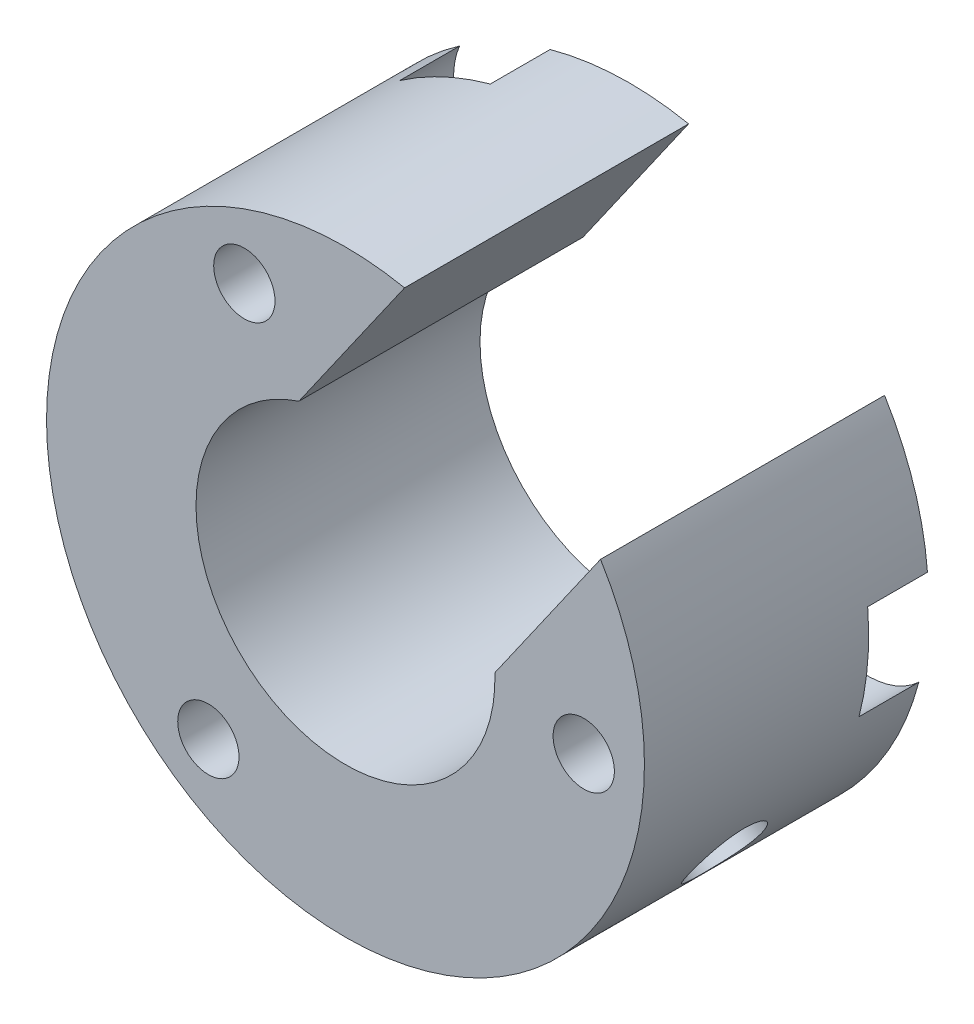
ISO-10303-21;
HEADER;
FILE_DESCRIPTION(('STEP AP214'),'2;1');
FILE_NAME('part.step','',(''),(''),'','','');
FILE_SCHEMA(('AUTOMOTIVE_DESIGN { 1 0 10303 214 1 1 1 1 }'));
ENDSEC;
DATA;
#1=APPLICATION_CONTEXT('core data for automotive mechanical design processes');
#2=APPLICATION_PROTOCOL_DEFINITION('international standard','automotive_design',2000,#1);
#3=PRODUCT_CONTEXT('',#1,'mechanical');
#4=PRODUCT('Part','Part','',(#3));
#5=PRODUCT_RELATED_PRODUCT_CATEGORY('part','',(#4));
#6=PRODUCT_DEFINITION_FORMATION('','',#4);
#7=PRODUCT_DEFINITION_CONTEXT('part definition',#1,'design');
#8=PRODUCT_DEFINITION('design','',#6,#7);
#9=PRODUCT_DEFINITION_SHAPE('','',#8);
#10=(LENGTH_UNIT() NAMED_UNIT(*) SI_UNIT(.MILLI.,.METRE.));
#11=(NAMED_UNIT(*) PLANE_ANGLE_UNIT() SI_UNIT($,.RADIAN.));
#12=(NAMED_UNIT(*) SI_UNIT($,.STERADIAN.) SOLID_ANGLE_UNIT());
#13=UNCERTAINTY_MEASURE_WITH_UNIT(LENGTH_MEASURE(1.E-05),#10,'distance_accuracy_value','');
#14=(GEOMETRIC_REPRESENTATION_CONTEXT(3) GLOBAL_UNCERTAINTY_ASSIGNED_CONTEXT((#13)) GLOBAL_UNIT_ASSIGNED_CONTEXT((#10,
#11,#12)) REPRESENTATION_CONTEXT('',''));
#15=CARTESIAN_POINT('',(0.,0.,0.));
#16=DIRECTION('',(0.,0.,1.));
#17=DIRECTION('',(1.,0.,0.));
#18=AXIS2_PLACEMENT_3D('',#15,#16,#17);
#19=CARTESIAN_POINT('',(-11.857295948113,5.24523020213218,9.5));
#20=DIRECTION('',(0.,0.,-1.));
#21=DIRECTION('',(-1.,0.,0.));
#22=AXIS2_PLACEMENT_3D('',#19,#20,#21);
#23=CYLINDRICAL_SURFACE('',#22,1.025);
#24=CARTESIAN_POINT('',(-11.857295948113,5.24523020213218,9.5));
#25=DIRECTION('',(0.,0.,1.));
#26=DIRECTION('',(1.,0.,0.));
#27=AXIS2_PLACEMENT_3D('',#24,#25,#26);
#28=CIRCLE('',#27,1.025);
#29=CARTESIAN_POINT('',(-10.832295948113,5.24523020213218,9.5));
#30=VERTEX_POINT('',#29);
#31=EDGE_CURVE('E216',#30,#30,#28,.T.);
#32=ORIENTED_EDGE('',*,*,#31,.T.);
#33=EDGE_LOOP('',(#32));
#34=FACE_BOUND('',#33,.T.);
#35=CARTESIAN_POINT('',(-11.857295948113,5.24523020213218,2.));
#36=DIRECTION('',(0.,0.,-1.));
#37=DIRECTION('',(-1.,0.,0.));
#38=AXIS2_PLACEMENT_3D('',#35,#36,#37);
#39=CIRCLE('',#38,1.025);
#40=CARTESIAN_POINT('',(-12.882295948113,5.24523020213218,2.));
#41=VERTEX_POINT('',#40);
#42=EDGE_CURVE('E42',#41,#41,#39,.T.);
#43=ORIENTED_EDGE('',*,*,#42,.T.);
#44=EDGE_LOOP('',(#43));
#45=FACE_BOUND('',#44,.T.);
#46=ADVANCED_FACE('F38',(#34,#45),#23,.F.);
#47=CARTESIAN_POINT('',(-13.0604293965396,-8.55884419296135,9.5));
#48=DIRECTION('',(0.,0.,-1.));
#49=DIRECTION('',(-1.,0.,0.));
#50=AXIS2_PLACEMENT_3D('',#47,#48,#49);
#51=CYLINDRICAL_SURFACE('',#50,1.025);
#52=CARTESIAN_POINT('',(-13.0604293965396,-8.55884419296135,9.5));
#53=DIRECTION('',(0.,0.,1.));
#54=DIRECTION('',(1.,0.,0.));
#55=AXIS2_PLACEMENT_3D('',#52,#53,#54);
#56=CIRCLE('',#55,1.025);
#57=CARTESIAN_POINT('',(-12.0354293965396,-8.55884419296135,9.5));
#58=VERTEX_POINT('',#57);
#59=EDGE_CURVE('E305',#58,#58,#56,.T.);
#60=ORIENTED_EDGE('',*,*,#59,.T.);
#61=EDGE_LOOP('',(#60));
#62=FACE_BOUND('',#61,.T.);
#63=CARTESIAN_POINT('',(-13.0604293965396,-8.55884419296135,2.));
#64=DIRECTION('',(0.,0.,-1.));
#65=DIRECTION('',(-1.,0.,0.));
#66=AXIS2_PLACEMENT_3D('',#63,#64,#65);
#67=CIRCLE('',#66,1.025);
#68=CARTESIAN_POINT('',(-14.0854293965396,-8.55884419296135,2.));
#69=VERTEX_POINT('',#68);
#70=EDGE_CURVE('E247',#69,#69,#67,.T.);
#71=ORIENTED_EDGE('',*,*,#70,.T.);
#72=EDGE_LOOP('',(#71));
#73=FACE_BOUND('',#72,.T.);
#74=ADVANCED_FACE('F207',(#62,#73),#51,.F.);
#75=CARTESIAN_POINT('',(-0.504183570444983,-2.69875112589484,9.5));
#76=DIRECTION('',(0.,0.,-1.));
#77=DIRECTION('',(-1.,0.,0.));
#78=AXIS2_PLACEMENT_3D('',#75,#76,#77);
#79=CYLINDRICAL_SURFACE('',#78,1.025);
#80=CARTESIAN_POINT('',(-0.504183570444983,-2.69875112589484,9.5));
#81=DIRECTION('',(0.,0.,1.));
#82=DIRECTION('',(1.,0.,0.));
#83=AXIS2_PLACEMENT_3D('',#80,#81,#82);
#84=CIRCLE('',#83,1.025);
#85=CARTESIAN_POINT('',(0.520816429555017,-2.69875112589484,9.5));
#86=VERTEX_POINT('',#85);
#87=EDGE_CURVE('E284',#86,#86,#84,.T.);
#88=ORIENTED_EDGE('',*,*,#87,.T.);
#89=EDGE_LOOP('',(#88));
#90=FACE_BOUND('',#89,.T.);
#91=CARTESIAN_POINT('',(-0.504183570444983,-2.69875112589484,2.));
#92=DIRECTION('',(0.,0.,-1.));
#93=DIRECTION('',(-1.,0.,0.));
#94=AXIS2_PLACEMENT_3D('',#91,#92,#93);
#95=CIRCLE('',#94,1.025);
#96=CARTESIAN_POINT('',(-1.52918357044498,-2.69875112589484,2.));
#97=VERTEX_POINT('',#96);
#98=EDGE_CURVE('E242',#97,#97,#95,.T.);
#99=ORIENTED_EDGE('',*,*,#98,.T.);
#100=EDGE_LOOP('',(#99));
#101=FACE_BOUND('',#100,.T.);
#102=ADVANCED_FACE('F40',(#90,#101),#79,.F.);
#103=CARTESIAN_POINT('',(-8.47396963836586,-2.00412170557468,9.5));
#104=DIRECTION('',(0.,0.,-1.));
#105=DIRECTION('',(-1.,0.,0.));
#106=AXIS2_PLACEMENT_3D('',#103,#104,#105);
#107=CYLINDRICAL_SURFACE('',#106,5.);
#108=CARTESIAN_POINT('',(-11.7239495250043,1.79556653643225,5.));
#109=CARTESIAN_POINT('',(-11.7239517287085,1.79556568537682,5.0690253754623));
#110=CARTESIAN_POINT('',(-11.7284612598949,1.79172165550188,5.138072449339));
#111=CARTESIAN_POINT('',(-11.7462470605814,1.77639856269207,5.27418378908702));
#112=CARTESIAN_POINT('',(-11.7595284322483,1.76491505620506,5.34124687723416));
#113=CARTESIAN_POINT('',(-11.7940990682446,1.73449649950596,5.47140176909352));
#114=CARTESIAN_POINT('',(-11.8153779939899,1.71557106815162,5.53449857769283));
#115=CARTESIAN_POINT('',(-11.8648578469074,1.67052003926457,5.65515542626996));
#116=CARTESIAN_POINT('',(-11.8930590679527,1.6443941360434,5.71271523104011));
#117=CARTESIAN_POINT('',(-11.9556920429574,1.58468216099718,5.8219308226311));
#118=CARTESIAN_POINT('',(-11.9902363202974,1.55095835026963,5.87344680017502));
#119=CARTESIAN_POINT('',(-12.063642345107,1.47682164706793,5.96788069718017));
#120=CARTESIAN_POINT('',(-12.1025044956884,1.43640812987735,6.01079781281087));
#121=CARTESIAN_POINT('',(-12.183513253913,1.34891930577348,6.08738773381564));
#122=CARTESIAN_POINT('',(-12.2256981244777,1.3017589128077,6.12092319408073));
#123=CARTESIAN_POINT('',(-12.311171562298,1.20215056387908,6.17690482207654));
#124=CARTESIAN_POINT('',(-12.3544599657187,1.14970338943654,6.19935262595776));
#125=CARTESIAN_POINT('',(-12.439626559338,1.0418899228656,6.23207391728929));
#126=CARTESIAN_POINT('',(-12.4815155525836,0.986604290912985,6.24258482216329));
#127=CARTESIAN_POINT('',(-12.5633640388631,0.873674900846389,6.25187918963778));
#128=CARTESIAN_POINT('',(-12.6033238162896,0.816031492629162,6.2506643861048));
#129=CARTESIAN_POINT('',(-12.6792903202368,0.701410319620786,6.23671257487493));
#130=CARTESIAN_POINT('',(-12.7153650878679,0.644446166679172,6.22423183747307));
#131=CARTESIAN_POINT('',(-12.7837524567598,0.531647432002117,6.18851436497575));
#132=CARTESIAN_POINT('',(-12.8160648576362,0.475812910561765,6.1652770573113));
#133=CARTESIAN_POINT('',(-12.8766985480381,0.366515947696505,6.10849871465647));
#134=CARTESIAN_POINT('',(-12.9049811379912,0.313079497466266,6.07486647766913));
#135=CARTESIAN_POINT('',(-12.9569720942921,0.210823956035438,5.99832216044187));
#136=CARTESIAN_POINT('',(-12.9806796634693,0.16200567027722,5.95540846571969));
#137=CARTESIAN_POINT('',(-13.0240651565942,0.0693588522224383,5.86014562900881));
#138=CARTESIAN_POINT('',(-13.0436166537761,0.025701125229976,5.80757255382611));
#139=CARTESIAN_POINT('',(-13.0779545308384,-0.0534323054452134,5.69520001322987));
#140=CARTESIAN_POINT('',(-13.0927406880105,-0.0889076267009151,5.6354002102545));
#141=CARTESIAN_POINT('',(-13.1177611557212,-0.150392329105279,5.50985498292552));
#142=CARTESIAN_POINT('',(-13.1279730471541,-0.176354976752786,5.4440821348434));
#143=CARTESIAN_POINT('',(-13.1438828259783,-0.217392713565776,5.30870726596177));
#144=CARTESIAN_POINT('',(-13.1495816793561,-0.2324701325825,5.23910606800843));
#145=CARTESIAN_POINT('',(-13.156471418435,-0.250761826598977,5.10002024923844));
#146=CARTESIAN_POINT('',(-13.1577773937892,-0.254278914874609,5.03058110333519));
#147=CARTESIAN_POINT('',(-13.1562261859432,-0.250132380630555,4.89208903171092));
#148=CARTESIAN_POINT('',(-13.1533693859767,-0.242469787335398,4.82303607102438));
#149=CARTESIAN_POINT('',(-13.143527605289,-0.216549787686517,4.68844286752265));
#150=CARTESIAN_POINT('',(-13.1366109327138,-0.198467780030959,4.62286363671458));
#151=CARTESIAN_POINT('',(-13.1186027562143,-0.152639727021912,4.49578427107416));
#152=CARTESIAN_POINT('',(-13.1075107577341,-0.124892536883035,4.43428462047233));
#153=CARTESIAN_POINT('',(-13.0807557364571,-0.0602169245281733,4.31577936106632));
#154=CARTESIAN_POINT('',(-13.0650073115402,-0.0231190703115439,4.25888557997845));
#155=CARTESIAN_POINT('',(-13.0288902951593,0.0585678119038818,4.15240581859932));
#156=CARTESIAN_POINT('',(-13.0085209442969,0.10315807088462,4.10282104167496));
#157=CARTESIAN_POINT('',(-12.9625212335621,0.199470297260233,4.01109447871452));
#158=CARTESIAN_POINT('',(-12.9367719891984,0.251342792565416,3.96916996872559));
#159=CARTESIAN_POINT('',(-12.8804308889281,0.359522278518112,3.89553206652438));
#160=CARTESIAN_POINT('',(-12.8498392857383,0.415829037669738,3.8638181416959));
#161=CARTESIAN_POINT('',(-12.7843985041676,0.530543422984165,3.81177698273603));
#162=CARTESIAN_POINT('',(-12.7495822336192,0.588932589568854,3.79136785781047));
#163=CARTESIAN_POINT('',(-12.6761853780527,0.706259369480354,3.76226983269579));
#164=CARTESIAN_POINT('',(-12.6376055210484,0.765196874751145,3.75357867063047));
#165=CARTESIAN_POINT('',(-12.558778506008,0.880157040334996,3.74829051303058));
#166=CARTESIAN_POINT('',(-12.5186046341689,0.936215425631109,3.75137286363076));
#167=CARTESIAN_POINT('',(-12.4368655409859,1.04548681497091,3.76880978411791));
#168=CARTESIAN_POINT('',(-12.3953003610563,1.09869990358666,3.78316401876638));
#169=CARTESIAN_POINT('',(-12.3124052997479,1.20067317203291,3.82256527471366));
#170=CARTESIAN_POINT('',(-12.2710753562597,1.24945578142046,3.84755431664328));
#171=CARTESIAN_POINT('',(-12.1898916364138,1.34187765308296,3.90746322377416));
#172=CARTESIAN_POINT('',(-12.1500380468553,1.38551626601546,3.94238434083696));
#173=CARTESIAN_POINT('',(-12.0723763519216,1.46787377757482,4.02214404249634));
#174=CARTESIAN_POINT('',(-12.0346401243288,1.5064497676299,4.06720017863422));
#175=CARTESIAN_POINT('',(-11.9638331854748,1.57684895614496,4.16552856496725));
#176=CARTESIAN_POINT('',(-11.9307636593873,1.60867044023501,4.21880289512238));
#177=CARTESIAN_POINT('',(-11.8702172556548,1.66565582300416,4.33325176775167));
#178=CARTESIAN_POINT('',(-11.8428562237414,1.69068444293057,4.39455515426579));
#179=CARTESIAN_POINT('',(-11.7959352496852,1.73292904030307,4.52256936240338));
#180=CARTESIAN_POINT('',(-11.7763696325557,1.75015070240233,4.58927620763343));
#181=CARTESIAN_POINT('',(-11.7489729645673,1.77405445624117,4.7132212647834));
#182=CARTESIAN_POINT('',(-11.7396230508642,1.78211328977067,4.76986645547983));
#183=CARTESIAN_POINT('',(-11.7271106716897,1.79286945776281,4.88433608624996));
#184=CARTESIAN_POINT('',(-11.7239476784179,1.7955672495712,4.94216042530633));
#185=CARTESIAN_POINT('',(-11.7239495250043,1.79556653643225,5.));
#186=B_SPLINE_CURVE_WITH_KNOTS('',3,(#108,#109,#110,#111,#112,#113,#114,#115,#116,#117,#118,
#119,#120,#121,#122,#123,#124,#125,#126,#127,#128,#129,#130,#131,#132,#133,#134,#135,#136,#137,
#138,#139,#140,#141,#142,#143,#144,#145,#146,#147,#148,#149,#150,#151,#152,#153,#154,#155,#156,
#157,#158,#159,#160,#161,#162,#163,#164,#165,#166,#167,#168,#169,#170,#171,#172,#173,#174,#175,
#176,#177,#178,#179,#180,#181,#182,#183,#184,#185),.UNSPECIFIED.,.T.,.F.,(4,2,2,2,2,2,2,2,2,2,2,
2,2,2,2,2,2,2,2,2,2,2,2,2,2,2,2,2,2,2,2,2,2,2,2,2,2,2,4),(0.,0.206863720868067,
0.413847870714333,0.620565363583009,0.827291633777393,1.03811977096488,1.24896760739933,
1.4627574819896,1.67651579923546,1.88594375497673,2.0953407433301,2.30009131344473,
2.50485278362393,2.71146437127222,2.91811192734457,3.13035233285956,3.34260265599901,
3.55588216004201,3.76911600064774,3.97671787380859,4.18430063591901,4.38848702504604,
4.59269760710709,4.80091422929579,5.00916509442523,5.2226266548266,5.43607707859777,
5.64796036403465,5.85980274454519,6.06591723063728,6.27202558688491,6.47702438279856,
6.68204902869036,6.89198548291036,7.10197515782755,7.31588238642339,7.5296336068331,
7.70298913588665,7.87632987549761),.UNSPECIFIED.);
#187=CARTESIAN_POINT('',(-11.7239495250043,1.79556653643225,5.));
#188=VERTEX_POINT('',#187);
#189=EDGE_CURVE('E159',#188,#188,#186,.T.);
#190=ORIENTED_EDGE('',*,*,#189,.F.);
#191=EDGE_LOOP('',(#190));
#192=FACE_BOUND('',#191,.T.);
#193=CARTESIAN_POINT('',(-3.79072107729812,-3.75545917027328,5.));
#194=CARTESIAN_POINT('',(-3.79072112176652,-3.75546153218569,4.9309746245377));
#195=CARTESIAN_POINT('',(-3.79278733157025,-3.76101519892462,4.861927550661));
#196=CARTESIAN_POINT('',(-3.80108880949662,-3.78297464663075,4.72581621091298));
#197=CARTESIAN_POINT('',(-3.80732650400205,-3.79938674344521,4.65875312276584));
#198=CARTESIAN_POINT('',(-3.82405857766835,-3.84228726996495,4.52859823090648));
#199=CARTESIAN_POINT('',(-3.83454746260409,-3.8687626911255,4.46550142230716));
#200=CARTESIAN_POINT('',(-3.85991782262325,-3.93068357517131,4.34484457373004));
#201=CARTESIAN_POINT('',(-3.87479948419929,-3.9661294188812,4.28728476895988));
#202=CARTESIAN_POINT('',(-3.90943658417562,-4.04543062206932,4.1780691773689));
#203=CARTESIAN_POINT('',(-3.92928286916154,-4.08943888810182,4.12655319982498));
#204=CARTESIAN_POINT('',(-3.97378029091838,-4.18380347201419,4.03211930281983));
#205=CARTESIAN_POINT('',(-3.9984318764692,-4.23416038265573,3.98920218718913));
#206=CARTESIAN_POINT('',(-4.05286820796881,-4.34024242196981,3.91261226618436));
#207=CARTESIAN_POINT('',(-4.08271977923154,-4.39603265106406,3.87907680591927));
#208=CARTESIAN_POINT('',(-4.14701224972773,-4.51046171199965,3.82309517792346));
#209=CARTESIAN_POINT('',(-4.18145247088392,-4.56910012214554,3.80064737404224));
#210=CARTESIAN_POINT('',(-4.2535585217415,-4.68605229045582,3.76792608271071));
#211=CARTESIAN_POINT('',(-4.29114487227705,-4.74434856056765,3.75741517783671));
#212=CARTESIAN_POINT('',(-4.36919407538009,-4.85993637887929,3.74812081036222));
#213=CARTESIAN_POINT('',(-4.40965650178735,-4.91722807436922,3.7493356138952));
#214=CARTESIAN_POINT('',(-4.49131046586926,-5.0278696270223,3.76328742512507));
#215=CARTESIAN_POINT('',(-4.53246590224094,-5.08127874269603,3.77576816252693));
#216=CARTESIAN_POINT('',(-4.6150046368999,-5.1841755067345,3.81148563502425));
#217=CARTESIAN_POINT('',(-4.65638794720097,-5.23366294618535,3.8347229426887));
#218=CARTESIAN_POINT('',(-4.73829357769217,-5.3280755417283,3.89150128534353));
#219=CARTESIAN_POINT('',(-4.77880473989962,-5.37295543526945,3.92513352233087));
#220=CARTESIAN_POINT('',(-4.85705650266149,-5.45683580791441,4.00167783955813));
#221=CARTESIAN_POINT('',(-4.89479661966898,-5.49583526212753,4.04459153428031));
#222=CARTESIAN_POINT('',(-4.9669698466878,-5.56833877384289,4.13985437099119));
#223=CARTESIAN_POINT('',(-5.00128580910804,-5.60166553323192,4.19242744617389));
#224=CARTESIAN_POINT('',(-5.06386369210076,-5.66103891288747,4.30479998677013));
#225=CARTESIAN_POINT('',(-5.09212532970348,-5.687085192893,4.3645997897455));
#226=CARTESIAN_POINT('',(-5.14131529007842,-5.73165805719995,4.49014501707448));
#227=CARTESIAN_POINT('',(-5.16220738984633,-5.75014756684172,4.5559178651566));
#228=CARTESIAN_POINT('',(-5.19530974353043,-5.77915534313605,4.69129273403823));
#229=CARTESIAN_POINT('',(-5.20752185528416,-5.78967531559523,4.76089393199157));
#230=CARTESIAN_POINT('',(-5.22234563342116,-5.80241541670597,4.89997975076156));
#231=CARTESIAN_POINT('',(-5.22520234915507,-5.80484742344529,4.96941889666482));
#232=CARTESIAN_POINT('',(-5.22183831492352,-5.80196935713134,5.10791096828908));
#233=CARTESIAN_POINT('',(-5.21561840057131,-5.79665999676433,5.17696392897562));
#234=CARTESIAN_POINT('',(-5.19463955355782,-5.77853280705143,5.31155713247735));
#235=CARTESIAN_POINT('',(-5.18002199742844,-5.76583924911156,5.37713636328542));
#236=CARTESIAN_POINT('',(-5.1431382846031,-5.73321875568098,5.50421572892584));
#237=CARTESIAN_POINT('',(-5.12087122187129,-5.71329096332494,5.56571537952767));
#238=CARTESIAN_POINT('',(-5.06927782660087,-5.66599521762324,5.68422063893368));
#239=CARTESIAN_POINT('',(-5.03982158008036,-5.63848897804445,5.74111442002155));
#240=CARTESIAN_POINT('',(-4.97545441060102,-5.57656924700864,5.84759418140068));
#241=CARTESIAN_POINT('',(-4.94054259137235,-5.54215462034102,5.89717895832504));
#242=CARTESIAN_POINT('',(-4.8658215590267,-5.46593923041018,5.98890552128548));
#243=CARTESIAN_POINT('',(-4.82591166401501,-5.4239752025453,6.03083003127441));
#244=CARTESIAN_POINT('',(-4.74358506655418,-5.33397824642354,6.10446793347562));
#245=CARTESIAN_POINT('',(-4.70116849499781,-5.28594563490509,6.1361818583041));
#246=CARTESIAN_POINT('',(-4.61582045806457,-5.18516072193542,6.18822301726397));
#247=CARTESIAN_POINT('',(-4.57289505942367,-5.13244566127085,6.20863214218953));
#248=CARTESIAN_POINT('',(-4.48781880782165,-5.02329116935779,6.23773016730421));
#249=CARTESIAN_POINT('',(-4.44566780693118,-4.96685245907881,6.24642132936953));
#250=CARTESIAN_POINT('',(-4.36467548742371,-4.853407396815,6.25170948696942));
#251=CARTESIAN_POINT('',(-4.32577549576476,-4.7964576541511,6.24862713636924));
#252=CARTESIAN_POINT('',(-4.2511253845749,-4.68222597386068,6.23119021588209));
#253=CARTESIAN_POINT('',(-4.2153751714012,-4.62494404616402,6.21683598123362));
#254=CARTESIAN_POINT('',(-4.14797748764596,-4.51212697790143,6.17743472528634));
#255=CARTESIAN_POINT('',(-4.11630896649789,-4.45658409378756,6.15244568335672));
#256=CARTESIAN_POINT('',(-4.05729814379925,-4.34864743859553,6.09253677622584));
#257=CARTESIAN_POINT('',(-4.02995638828073,-4.29625406549802,6.05761565916304));
#258=CARTESIAN_POINT('',(-3.97919393187246,-4.19507466250696,5.97785595750366));
#259=CARTESIAN_POINT('',(-3.95588286099589,-4.1464051252557,5.93279982136578));
#260=CARTESIAN_POINT('',(-3.9140061708437,-4.05576291017162,5.83447143503275));
#261=CARTESIAN_POINT('',(-3.89544175607899,-4.0137919331781,5.78119710487762));
#262=CARTESIAN_POINT('',(-3.86265126515348,-3.93738522824231,5.66674823224833));
#263=CARTESIAN_POINT('',(-3.84851258598606,-3.90310468515746,5.60544484573421));
#264=CARTESIAN_POINT('',(-3.82490201131576,-3.84454937303905,5.47743063759662));
#265=CARTESIAN_POINT('',(-3.81542671972503,-3.82026732476485,5.41072379236657));
#266=CARTESIAN_POINT('',(-3.80235702631341,-3.78633872357676,5.2867787352166));
#267=CARTESIAN_POINT('',(-3.79798963860078,-3.7747935250649,5.23013354452017));
#268=CARTESIAN_POINT('',(-3.79217176987088,-3.75935308511254,5.11566391375005));
#269=CARTESIAN_POINT('',(-3.79072104003597,-3.75545719111695,5.05783957469367));
#270=CARTESIAN_POINT('',(-3.79072107729812,-3.75545917027328,5.));
#271=B_SPLINE_CURVE_WITH_KNOTS('',3,(#193,#194,#195,#196,#197,#198,#199,#200,#201,#202,#203,
#204,#205,#206,#207,#208,#209,#210,#211,#212,#213,#214,#215,#216,#217,#218,#219,#220,#221,#222,
#223,#224,#225,#226,#227,#228,#229,#230,#231,#232,#233,#234,#235,#236,#237,#238,#239,#240,#241,
#242,#243,#244,#245,#246,#247,#248,#249,#250,#251,#252,#253,#254,#255,#256,#257,#258,#259,#260,
#261,#262,#263,#264,#265,#266,#267,#268,#269,#270),.UNSPECIFIED.,.T.,.F.,(4,2,2,2,2,2,2,2,2,2,2,
2,2,2,2,2,2,2,2,2,2,2,2,2,2,2,2,2,2,2,2,2,2,2,2,2,2,2,4),(0.,0.206863720868067,
0.413847870714333,0.620565363583011,0.827291633777395,1.03811977096488,1.24896760739933,
1.4627574819896,1.67651579923546,1.88594375497673,2.0953407433301,2.30009131344474,
2.50485278362393,2.71146437127222,2.91811192734457,3.13035233285956,3.34260265599901,
3.55588216004201,3.76911600064774,3.97671787380859,4.18430063591901,4.38848702504604,
4.59269760710709,4.80091422929579,5.00916509442522,5.22262665482659,5.43607707859777,
5.64796036403465,5.85980274454519,6.06591723063728,6.27202558688491,6.47702438279856,
6.68204902869036,6.89198548291036,7.10197515782755,7.31588238642339,7.5296336068331,
7.70298913588665,7.8763298754976),.UNSPECIFIED.);
#272=CARTESIAN_POINT('',(-3.79072107729812,-3.75545917027328,5.));
#273=VERTEX_POINT('',#272);
#274=EDGE_CURVE('E151',#273,#273,#271,.T.);
#275=ORIENTED_EDGE('',*,*,#274,.F.);
#276=EDGE_LOOP('',(#275));
#277=FACE_BOUND('',#276,.T.);
#278=CARTESIAN_POINT('',(-8.47396963836586,-2.00412170557468,0.));
#279=DIRECTION('',(0.,0.,1.));
#280=DIRECTION('',(1.,0.,0.));
#281=AXIS2_PLACEMENT_3D('',#278,#279,#280);
#282=CIRCLE('',#281,5.);
#283=CARTESIAN_POINT('',(-10.031408472744,2.74712910628221,0.));
#284=VERTEX_POINT('',#283);
#285=CARTESIAN_POINT('',(-3.47668598535736,-1.83933065189158,0.));
#286=VERTEX_POINT('',#285);
#287=EDGE_CURVE('E291',#284,#286,#282,.T.);
#288=ORIENTED_EDGE('',*,*,#287,.F.);
#289=DIRECTION('',(0.,0.,-1.));
#290=VECTOR('',#289,1.);
#291=CARTESIAN_POINT('',(-10.031408472744,2.74712910628221,9.5));
#292=LINE('',#291,#290);
#293=CARTESIAN_POINT('',(-10.031408472744,2.74712910628221,9.5));
#294=VERTEX_POINT('',#293);
#295=EDGE_CURVE('E268',#294,#284,#292,.T.);
#296=ORIENTED_EDGE('',*,*,#295,.F.);
#297=CARTESIAN_POINT('',(-8.47396963836586,-2.00412170557468,9.5));
#298=DIRECTION('',(0.,0.,1.));
#299=DIRECTION('',(1.,0.,0.));
#300=AXIS2_PLACEMENT_3D('',#297,#298,#299);
#301=CIRCLE('',#300,5.);
#302=CARTESIAN_POINT('',(-3.47668598535736,-1.83933065189158,9.5));
#303=VERTEX_POINT('',#302);
#304=EDGE_CURVE('E301',#294,#303,#301,.T.);
#305=ORIENTED_EDGE('',*,*,#304,.T.);
#306=DIRECTION('',(0.,0.,-1.));
#307=VECTOR('',#306,1.);
#308=CARTESIAN_POINT('',(-3.47668598535736,-1.83933065189158,9.5));
#309=LINE('',#308,#307);
#310=EDGE_CURVE('E278',#303,#286,#309,.T.);
#311=ORIENTED_EDGE('',*,*,#310,.T.);
#312=EDGE_LOOP('',(#288,#296,#305,#311));
#313=FACE_BOUND('',#312,.T.);
#314=ADVANCED_FACE('F164',(#192,#277,#313),#107,.F.);
#315=CARTESIAN_POINT('',(-8.02469026658233,5.61502322185462,9.5));
#316=DIRECTION('',(-0.819340310923333,0.573307469771724,0.));
#317=DIRECTION('',(-0.573307469771724,-0.819340310923333,0.));
#318=AXIS2_PLACEMENT_3D('',#315,#316,#317);
#319=PLANE('',#318);
#320=DIRECTION('',(0.573307469771724,0.819340310923333,0.));
#321=VECTOR('',#320,1.);
#322=CARTESIAN_POINT('',(-8.02469026658233,5.61502322185462,0.));
#323=LINE('',#322,#321);
#324=CARTESIAN_POINT('',(-6.49688112863413,7.79848616298187,0.));
#325=VERTEX_POINT('',#324);
#326=EDGE_CURVE('E289',#284,#325,#323,.T.);
#327=ORIENTED_EDGE('',*,*,#326,.T.);
#328=DIRECTION('',(0.,0.,-1.));
#329=VECTOR('',#328,1.);
#330=CARTESIAN_POINT('',(-6.49688112863413,7.79848616298187,9.5));
#331=LINE('',#330,#329);
#332=CARTESIAN_POINT('',(-6.49688112863413,7.79848616298187,9.5));
#333=VERTEX_POINT('',#332);
#334=EDGE_CURVE('E269',#333,#325,#331,.T.);
#335=ORIENTED_EDGE('',*,*,#334,.F.);
#336=DIRECTION('',(0.573307469771724,0.819340310923333,0.));
#337=VECTOR('',#336,1.);
#338=CARTESIAN_POINT('',(-8.02469026658233,5.61502322185462,9.5));
#339=LINE('',#338,#337);
#340=EDGE_CURVE('E298',#294,#333,#339,.T.);
#341=ORIENTED_EDGE('',*,*,#340,.F.);
#342=ORIENTED_EDGE('',*,*,#295,.T.);
#343=EDGE_LOOP('',(#327,#335,#341,#342));
#344=FACE_BOUND('',#343,.T.);
#345=ADVANCED_FACE('F197',(#344),#319,.F.);
#346=CARTESIAN_POINT('',(-8.47396963836586,-2.00412170557468,9.5));
#347=DIRECTION('',(0.,0.,-1.));
#348=DIRECTION('',(-1.,0.,0.));
#349=AXIS2_PLACEMENT_3D('',#346,#347,#348);
#350=CYLINDRICAL_SURFACE('',#349,10.);
#351=CARTESIAN_POINT('',(-8.47396963836586,-2.00412170557468,0.));
#352=DIRECTION('',(0.,0.,1.));
#353=DIRECTION('',(1.,0.,0.));
#354=AXIS2_PLACEMENT_3D('',#351,#352,#353);
#355=CIRCLE('',#354,10.);
#356=CARTESIAN_POINT('',(-12.7571867547964,-11.0403848233417,0.));
#357=VERTEX_POINT('',#356);
#358=CARTESIAN_POINT('',(1.20306576650411,-4.52503141694735,0.));
#359=VERTEX_POINT('',#358);
#360=EDGE_CURVE('E252',#357,#359,#355,.T.);
#361=ORIENTED_EDGE('',*,*,#360,.T.);
#362=DIRECTION('',(0.,0.,-1.));
#363=VECTOR('',#362,1.);
#364=CARTESIAN_POINT('',(1.20306576650412,-4.52503141694736,1.));
#365=LINE('',#364,#363);
#366=CARTESIAN_POINT('',(1.20306576650412,-4.52503141694736,2.));
#367=VERTEX_POINT('',#366);
#368=EDGE_CURVE('E55',#359,#367,#365,.F.);
#369=ORIENTED_EDGE('',*,*,#368,.T.);
#370=CARTESIAN_POINT('',(-8.47396963836586,-2.00412170557468,2.));
#371=DIRECTION('',(0.,0.,-1.));
#372=DIRECTION('',(-1.,0.,0.));
#373=AXIS2_PLACEMENT_3D('',#370,#371,#372);
#374=CIRCLE('',#373,10.);
#375=CARTESIAN_POINT('',(1.49327233511602,-1.19536497944428,2.));
#376=VERTEX_POINT('',#375);
#377=EDGE_CURVE('E245',#376,#367,#374,.T.);
#378=ORIENTED_EDGE('',*,*,#377,.F.);
#379=DIRECTION('',(0.,0.,-1.));
#380=VECTOR('',#379,1.);
#381=CARTESIAN_POINT('',(1.49327233511602,-1.19536497944428,1.));
#382=LINE('',#381,#380);
#383=CARTESIAN_POINT('',(1.49327233511602,-1.19536497944428,0.));
#384=VERTEX_POINT('',#383);
#385=EDGE_CURVE('E248',#376,#384,#382,.T.);
#386=ORIENTED_EDGE('',*,*,#385,.T.);
#387=CARTESIAN_POINT('',(0.057841358752538,3.21202640480808,0.));
#388=VERTEX_POINT('',#387);
#389=EDGE_CURVE('E288',#384,#388,#355,.T.);
#390=ORIENTED_EDGE('',*,*,#389,.T.);
#391=DIRECTION('',(0.,0.,-1.));
#392=VECTOR('',#391,1.);
#393=CARTESIAN_POINT('',(0.057841358752538,3.21202640480808,9.5));
#394=LINE('',#393,#392);
#395=CARTESIAN_POINT('',(0.057841358752538,3.21202640480808,9.5));
#396=VERTEX_POINT('',#395);
#397=EDGE_CURVE('E273',#396,#388,#394,.T.);
#398=ORIENTED_EDGE('',*,*,#397,.F.);
#399=CARTESIAN_POINT('',(-8.47396963836586,-2.00412170557468,9.5));
#400=DIRECTION('',(0.,0.,1.));
#401=DIRECTION('',(1.,0.,0.));
#402=AXIS2_PLACEMENT_3D('',#399,#400,#401);
#403=CIRCLE('',#402,10.);
#404=EDGE_CURVE('E296',#333,#396,#403,.T.);
#405=ORIENTED_EDGE('',*,*,#404,.F.);
#406=ORIENTED_EDGE('',*,*,#334,.T.);
#407=CARTESIAN_POINT('',(-11.1293154901052,7.63689164405049,0.));
#408=VERTEX_POINT('',#407);
#409=EDGE_CURVE('E285',#325,#408,#355,.T.);
#410=ORIENTED_EDGE('',*,*,#409,.T.);
#411=DIRECTION('',(0.,0.,-1.));
#412=VECTOR('',#411,1.);
#413=CARTESIAN_POINT('',(-11.1293154901052,7.6368916440505,1.));
#414=LINE('',#413,#412);
#415=CARTESIAN_POINT('',(-11.1293154901052,7.6368916440505,2.));
#416=VERTEX_POINT('',#415);
#417=EDGE_CURVE('E129',#408,#416,#414,.F.);
#418=ORIENTED_EDGE('',*,*,#417,.T.);
#419=CARTESIAN_POINT('',(-8.47396963836586,-2.00412170557468,2.));
#420=DIRECTION('',(0.,0.,-1.));
#421=DIRECTION('',(-1.,0.,0.));
#422=AXIS2_PLACEMENT_3D('',#419,#420,#421);
#423=CIRCLE('',#422,10.);
#424=CARTESIAN_POINT('',(-14.1579944954172,6.22338468606198,2.));
#425=VERTEX_POINT('',#424);
#426=EDGE_CURVE('E134',#425,#416,#423,.T.);
#427=ORIENTED_EDGE('',*,*,#426,.F.);
#428=DIRECTION('',(0.,0.,-1.));
#429=VECTOR('',#428,1.);
#430=CARTESIAN_POINT('',(-14.1579944954172,6.22338468606198,1.));
#431=LINE('',#430,#429);
#432=CARTESIAN_POINT('',(-14.1579944954172,6.22338468606198,0.));
#433=VERTEX_POINT('',#432);
#434=EDGE_CURVE('E118',#425,#433,#431,.T.);
#435=ORIENTED_EDGE('',*,*,#434,.T.);
#436=CARTESIAN_POINT('',(-15.4956591914965,-9.12422534382713,0.));
#437=VERTEX_POINT('',#436);
#438=EDGE_CURVE('E287',#433,#437,#355,.T.);
#439=ORIENTED_EDGE('',*,*,#438,.T.);
#440=DIRECTION('',(0.,0.,-1.));
#441=VECTOR('',#440,1.);
#442=CARTESIAN_POINT('',(-15.4956591914965,-9.12422534382713,1.));
#443=LINE('',#442,#441);
#444=CARTESIAN_POINT('',(-15.4956591914965,-9.12422534382713,2.));
#445=VERTEX_POINT('',#444);
#446=EDGE_CURVE('E62',#437,#445,#443,.F.);
#447=ORIENTED_EDGE('',*,*,#446,.T.);
#448=CARTESIAN_POINT('',(-8.47396963836586,-2.00412170557468,2.));
#449=DIRECTION('',(0.,0.,-1.));
#450=DIRECTION('',(-1.,0.,0.));
#451=AXIS2_PLACEMENT_3D('',#448,#449,#450);
#452=CIRCLE('',#451,10.);
#453=CARTESIAN_POINT('',(-12.7571867547964,-11.0403848233417,2.));
#454=VERTEX_POINT('',#453);
#455=EDGE_CURVE('E147',#454,#445,#452,.T.);
#456=ORIENTED_EDGE('',*,*,#455,.F.);
#457=DIRECTION('',(0.,0.,-1.));
#458=VECTOR('',#457,1.);
#459=CARTESIAN_POINT('',(-12.7571867547964,-11.0403848233417,1.));
#460=LINE('',#459,#458);
#461=EDGE_CURVE('E258',#454,#357,#460,.T.);
#462=ORIENTED_EDGE('',*,*,#461,.T.);
#463=EDGE_LOOP('',(#361,#369,#378,#386,#390,#398,#405,#406,#410,#418,#427,#435,#439,#447,#456,#462));
#464=FACE_BOUND('',#463,.T.);
#465=CARTESIAN_POINT('',(-15.8864754330267,4.70816239479825,5.));
#466=CARTESIAN_POINT('',(-15.886477960147,4.70816053505077,5.06991814189591));
#467=CARTESIAN_POINT('',(-15.8904620453771,4.70376801092402,5.13987998245241));
#468=CARTESIAN_POINT('',(-15.9062416515461,4.68627933573961,5.2778566127023));
#469=CARTESIAN_POINT('',(-15.9180453351066,4.67317408970718,5.34586929024852));
#470=CARTESIAN_POINT('',(-15.9489603387495,4.63854713282743,5.47792994105802));
#471=CARTESIAN_POINT('',(-15.9680666989552,4.61703113422133,5.54198057105933));
#472=CARTESIAN_POINT('',(-16.0128054528421,4.56604567575457,5.66436422591154));
#473=CARTESIAN_POINT('',(-16.0384367308484,4.53657757554676,5.72269822587153));
#474=CARTESIAN_POINT('',(-16.0953687227078,4.47014994879929,5.83233112356106));
#475=CARTESIAN_POINT('',(-16.1266971332026,4.43315371480075,5.88359340115944));
#476=CARTESIAN_POINT('',(-16.1937573351556,4.35257710750792,5.97731138446954));
#477=CARTESIAN_POINT('',(-16.2294893455447,4.30899640683382,6.01976665204734));
#478=CARTESIAN_POINT('',(-16.3041918216941,4.21610170473092,6.09479678975318));
#479=CARTESIAN_POINT('',(-16.3431726058255,4.1667692206599,6.12733852254983));
#480=CARTESIAN_POINT('',(-16.422915639147,4.06370311862476,6.18140559997048));
#481=CARTESIAN_POINT('',(-16.4636778221578,4.00996966409281,6.20293135346326));
#482=CARTESIAN_POINT('',(-16.5454233365429,3.89980182469298,6.23424603416721));
#483=CARTESIAN_POINT('',(-16.5864043916722,3.84338305900697,6.24409583926195));
#484=CARTESIAN_POINT('',(-16.6675384556982,3.7291441239985,6.25196769251827));
#485=CARTESIAN_POINT('',(-16.7076914971073,3.67132400989548,6.24999020597627));
#486=CARTESIAN_POINT('',(-16.7858142194038,3.55627840005336,6.23431239862129));
#487=CARTESIAN_POINT('',(-16.8237948329209,3.49905138664521,6.22067755075931));
#488=CARTESIAN_POINT('',(-16.8968576609914,3.38656087110941,6.18217441168503));
#489=CARTESIAN_POINT('',(-16.9319398204289,3.33129740633112,6.15730590691659));
#490=CARTESIAN_POINT('',(-16.9985168802236,3.22427014253561,6.09697175360811));
#491=CARTESIAN_POINT('',(-17.0300018742648,3.17251616025737,6.06147777113491));
#492=CARTESIAN_POINT('',(-17.0886700535513,3.07428505196556,5.98092081889199));
#493=CARTESIAN_POINT('',(-17.1158530414055,3.02780816811128,5.93585741026571));
#494=CARTESIAN_POINT('',(-17.1656364960518,2.94132460638082,5.83707409070081));
#495=CARTESIAN_POINT('',(-17.1882043728901,2.9013643214946,5.78329712022667));
#496=CARTESIAN_POINT('',(-17.228193815069,2.82963983947175,5.66880922160877));
#497=CARTESIAN_POINT('',(-17.2456153642781,2.79787566802625,5.60809827173097));
#498=CARTESIAN_POINT('',(-17.2750931317421,2.743633900348,5.48141525221884));
#499=CARTESIAN_POINT('',(-17.2871470691135,2.72116025226904,5.4154409600234));
#500=CARTESIAN_POINT('',(-17.3057340075774,2.68632938741238,5.28013027323658));
#501=CARTESIAN_POINT('',(-17.3122672747408,2.67397168309344,5.21079404084564));
#502=CARTESIAN_POINT('',(-17.319713954298,2.65987568978595,5.07122840900012));
#503=CARTESIAN_POINT('',(-17.320664975516,2.65806633480015,5.0010081884556));
#504=CARTESIAN_POINT('',(-17.317037288861,2.66494340950455,4.86122903516729));
#505=CARTESIAN_POINT('',(-17.3124586988513,2.67362961548257,4.79167008836034));
#506=CARTESIAN_POINT('',(-17.2978480125592,2.70113164274264,4.65542711821107));
#507=CARTESIAN_POINT('',(-17.287834355586,2.71991321186385,4.5887341924048));
#508=CARTESIAN_POINT('',(-17.2624805724464,2.76691427911347,4.45983792257342));
#509=CARTESIAN_POINT('',(-17.2471402591379,2.795134108836,4.39763473637957));
#510=CARTESIAN_POINT('',(-17.2112263430063,2.86021057476266,4.2791226780935));
#511=CARTESIAN_POINT('',(-17.1906255320234,2.8971120332482,4.22284666734279));
#512=CARTESIAN_POINT('',(-17.1445136862789,2.97823085787783,4.11812172303248));
#513=CARTESIAN_POINT('',(-17.119002460519,3.02244850858726,4.06967309406601));
#514=CARTESIAN_POINT('',(-17.0633119375025,3.11703266313139,3.9816979063328));
#515=CARTESIAN_POINT('',(-17.0331068614952,3.16743277828527,3.9422237766025));
#516=CARTESIAN_POINT('',(-16.968694985126,3.27256631584564,3.8736808911831));
#517=CARTESIAN_POINT('',(-16.9344882654428,3.32729965088127,3.84461192575951));
#518=CARTESIAN_POINT('',(-16.8629057581224,3.43923650817966,3.79779110654598));
#519=CARTESIAN_POINT('',(-16.8255387632589,3.49643297271446,3.78000895198419));
#520=CARTESIAN_POINT('',(-16.7484749361521,3.61169214601325,3.75616795538662));
#521=CARTESIAN_POINT('',(-16.7087782090536,3.66975481559587,3.75010858470038));
#522=CARTESIAN_POINT('',(-16.6284223455462,3.78464173907228,3.74989503885392));
#523=CARTESIAN_POINT('',(-16.5877716105586,3.84147173577161,3.75566001971601));
#524=CARTESIAN_POINT('',(-16.5064552206531,3.95271672995296,3.77876030671542));
#525=CARTESIAN_POINT('',(-16.4657895657454,4.00713172911451,3.79609560480588));
#526=CARTESIAN_POINT('',(-16.3857489327021,4.11209499133681,3.84181905717485));
#527=CARTESIAN_POINT('',(-16.3463735076807,4.16264460148501,3.87020333968661));
#528=CARTESIAN_POINT('',(-16.2702146735367,4.2586510580693,3.93721065730378));
#529=CARTESIAN_POINT('',(-16.2334312952356,4.30410784395179,3.97583381413085));
#530=CARTESIAN_POINT('',(-16.1635147470752,4.38915220529624,4.06252160766819));
#531=CARTESIAN_POINT('',(-16.1304070492535,4.42869941057319,4.11064639676183));
#532=CARTESIAN_POINT('',(-16.0693412012347,4.5006892271232,4.21484647201443));
#533=CARTESIAN_POINT('',(-16.0413842726933,4.53313015327808,4.27092363874545));
#534=CARTESIAN_POINT('',(-15.9916177972614,4.59030114148343,4.38968496134868));
#535=CARTESIAN_POINT('',(-15.9698324064228,4.61500094296502,4.45239379496755));
#536=CARTESIAN_POINT('',(-15.9334624628163,4.65596266765508,4.58242837029738));
#537=CARTESIAN_POINT('',(-15.9188700788584,4.67223376836856,4.6497489996517));
#538=CARTESIAN_POINT('',(-15.9009838263955,4.69211377444722,4.76451499352177));
#539=CARTESIAN_POINT('',(-15.8955539272349,4.69812539815446,4.81123647576879));
#540=CARTESIAN_POINT('',(-15.8882988883232,4.70615032303391,4.90529862498346));
#541=CARTESIAN_POINT('',(-15.8864737212218,4.70816365454233,4.95263928725048));
#542=CARTESIAN_POINT('',(-15.8864754330267,4.70816239479825,5.));
#543=B_SPLINE_CURVE_WITH_KNOTS('',3,(#465,#466,#467,#468,#469,#470,#471,#472,#473,#474,#475,
#476,#477,#478,#479,#480,#481,#482,#483,#484,#485,#486,#487,#488,#489,#490,#491,#492,#493,#494,
#495,#496,#497,#498,#499,#500,#501,#502,#503,#504,#505,#506,#507,#508,#509,#510,#511,#512,#513,
#514,#515,#516,#517,#518,#519,#520,#521,#522,#523,#524,#525,#526,#527,#528,#529,#530,#531,#532,
#533,#534,#535,#536,#537,#538,#539,#540,#541,#542),.UNSPECIFIED.,.T.,.F.,(4,2,2,2,2,2,2,2,2,2,2,
2,2,2,2,2,2,2,2,2,2,2,2,2,2,2,2,2,2,2,2,2,2,2,2,2,2,2,4),(0.,0.209581408739619,
0.419381938076191,0.6290402262906,0.838662689753064,1.04933288774533,1.2600135637129,
1.4713909307287,1.68276045169915,1.89302298470729,2.10327724585055,2.31235832466519,
2.52144337835895,2.73109102206402,2.94074828234553,3.15183848688885,3.36292935309713,
3.57410983369505,3.78528013578095,3.99502608902942,4.20476757163558,4.41380188146367,
4.62284353605927,4.83298909772056,5.04314283497406,5.25449442946171,5.46584176354439,
5.67661928392471,5.88738729886407,6.09671908144128,6.30605071843395,6.51530906772045,
6.72456990482125,6.93520064445419,7.14588127719915,7.35737548852418,7.56863892991008,
7.71060494816475,7.85256988927737),.UNSPECIFIED.);
#544=CARTESIAN_POINT('',(-15.8864754330267,4.70816239479825,5.));
#545=VERTEX_POINT('',#544);
#546=EDGE_CURVE('E144',#545,#545,#543,.T.);
#547=ORIENTED_EDGE('',*,*,#546,.T.);
#548=EDGE_LOOP('',(#547));
#549=FACE_BOUND('',#548,.T.);
#550=CARTESIAN_POINT('',(0.371804830724321,-6.66805502863928,5.));
#551=CARTESIAN_POINT('',(0.371803949436529,-6.66805804000601,4.93008185810409));
#552=CARTESIAN_POINT('',(0.369042409648646,-6.67330600164117,4.86012001754759));
#553=CARTESIAN_POINT('',(0.358019040072269,-6.69412270295855,4.7221433872977));
#554=CARTESIAN_POINT('',(0.349751462664349,-6.70970222743692,4.65413070975148));
#555=CARTESIAN_POINT('',(0.3278131771335,-6.75061035891415,4.52207005894198));
#556=CARTESIAN_POINT('',(0.314146136039816,-6.77593234904276,4.45801942894067));
#557=CARTESIAN_POINT('',(0.281576093899173,-6.83543247870123,4.33563577408846));
#558=CARTESIAN_POINT('',(0.262673987930726,-6.86960910422291,4.27730177412847));
#559=CARTESIAN_POINT('',(0.219774380873021,-6.94585544844138,4.16766887643894));
#560=CARTESIAN_POINT('',(0.195751884203274,-6.98796376457909,4.11640659884056));
#561=CARTESIAN_POINT('',(0.143030065374685,-7.0785732019916,4.02268861553046));
#562=CARTESIAN_POINT('',(0.114330510666847,-7.12707464111729,3.98023334795266));
#563=CARTESIAN_POINT('',(0.0526547644941026,-7.2290843855326,3.90520321024682));
#564=CARTESIAN_POINT('',(0.0196647446378385,-7.28260871743871,3.87266147745017));
#565=CARTESIAN_POINT('',(-0.0498396228274885,-7.39283900209441,3.81859440002952));
#566=CARTESIAN_POINT('',(-0.086353839572762,-7.44954483667274,3.79706864653674));
#567=CARTESIAN_POINT('',(-0.161843936623164,-7.56408970651607,3.76575396583279));
#568=CARTESIAN_POINT('',(-0.200805923135136,-7.62192125161119,3.75590416073805));
#569=CARTESIAN_POINT('',(-0.280330189159642,-7.73728659185904,3.74803230748173));
#570=CARTESIAN_POINT('',(-0.320892405655308,-7.79482039863595,3.75000979402373));
#571=CARTESIAN_POINT('',(-0.402206314112038,-7.90763307688822,3.76568760137871));
#572=CARTESIAN_POINT('',(-0.442955685949926,-7.96292273922735,3.77932244924069));
#573=CARTESIAN_POINT('',(-0.523602872909329,-8.07010633949668,3.81782558831497));
#574=CARTESIAN_POINT('',(-0.563500671827013,-8.12200021285016,3.84269409308341));
#575=CARTESIAN_POINT('',(-0.64123757423849,-8.22121872972039,3.90302824639189));
#576=CARTESIAN_POINT('',(-0.679070849492954,-8.26853070299306,3.93852222886509));
#577=CARTESIAN_POINT('',(-0.751253922487741,-8.35730519184009,4.01907918110801));
#578=CARTESIAN_POINT('',(-0.785603560360699,-8.3987674389992,4.06414258973428));
#579=CARTESIAN_POINT('',(-0.849794427347553,-8.4751698695992,4.16292590929919));
#580=CARTESIAN_POINT('',(-0.879603238266313,-8.51006353986739,4.21670287977333));
#581=CARTESIAN_POINT('',(-0.933284216437335,-8.57220780259391,4.33119077839122));
#582=CARTESIAN_POINT('',(-0.957156365080819,-8.59945837109459,4.39190172826903));
#583=CARTESIAN_POINT('',(-0.998014584987916,-8.64573702709868,4.51858474778116));
#584=CARTESIAN_POINT('',(-1.01499772860324,-8.6647616190016,4.5845590399766));
#585=CARTESIAN_POINT('',(-1.04135163150178,-8.69415779613631,4.71986972676341));
#586=CARTESIAN_POINT('',(-1.05072275764851,-8.70452979838296,4.78920595915436));
#587=CARTESIAN_POINT('',(-1.0614139814337,-8.71635552448025,4.92877159099988));
#588=CARTESIAN_POINT('',(-1.06278795711309,-8.71786893045824,4.9989918115444));
#589=CARTESIAN_POINT('',(-1.05757014658729,-8.71210449464249,5.13877096483271));
#590=CARTESIAN_POINT('',(-1.05097853016818,-8.70482684022963,5.20832991163966));
#591=CARTESIAN_POINT('',(-1.03014742303006,-8.68167735572695,5.34457288178893));
#592=CARTESIAN_POINT('',(-1.01593379312337,-8.6658345848359,5.4112658075952));
#593=CARTESIAN_POINT('',(-0.980464948426877,-8.62591121200754,5.54016207742658));
#594=CARTESIAN_POINT('',(-0.959209486236849,-8.60183032063992,5.60236526362043));
#595=CARTESIAN_POINT('',(-0.91037767900925,-8.54579274046109,5.7208773219065));
#596=CARTESIAN_POINT('',(-0.882768547404427,-8.5137951326827,5.77715333265721));
#597=CARTESIAN_POINT('',(-0.822359649009112,-8.44268021848093,5.88187827696752));
#598=CARTESIAN_POINT('',(-0.789559680321733,-8.40356263511821,5.93032690593399));
#599=CARTESIAN_POINT('',(-0.719782547610799,-8.31883514019877,6.0183020936672));
#600=CARTESIAN_POINT('',(-0.6827826395899,-8.27318949385025,6.0577762233975));
#601=CARTESIAN_POINT('',(-0.606082959927446,-8.17665395802521,6.1263191088169));
#602=CARTESIAN_POINT('',(-0.566383242724516,-8.12576417428019,6.15538807424049));
#603=CARTESIAN_POINT('',(-0.485748987079738,-8.02016099159741,6.20220889345402));
#604=CARTESIAN_POINT('',(-0.444818066415961,-7.96545827142714,6.2199910480158));
#605=CARTESIAN_POINT('',(-0.362940705193026,-7.8535672163913,6.24383204461338));
#606=CARTESIAN_POINT('',(-0.321994265417012,-7.79637899373083,6.24989141529962));
#607=CARTESIAN_POINT('',(-0.24159459470422,-7.68152272296092,6.25010496114608));
#608=CARTESIAN_POINT('',(-0.202133089947749,-7.62386060001848,6.24433998028399));
#609=CARTESIAN_POINT('',(-0.125484006657262,-7.50934980564341,6.22123969328458));
#610=CARTESIAN_POINT('',(-0.0882964265418094,-7.45250113364507,6.20390439519412));
#611=CARTESIAN_POINT('',(-0.0171117067940139,-7.34134122617503,6.15818094282515));
#612=CARTESIAN_POINT('',(0.0168865452640431,-7.28702910930638,6.12979666031339));
#613=CARTESIAN_POINT('',(0.0809866824358356,-7.18258496088921,6.06278934269622));
#614=CARTESIAN_POINT('',(0.111088521221943,-7.13245297904424,6.02416618586915));
#615=CARTESIAN_POINT('',(0.167028961150741,-7.03762927797891,5.93747839233181));
#616=CARTESIAN_POINT('',(0.192838363467726,-6.99297532124148,5.88935360323818));
#617=CARTESIAN_POINT('',(0.239547056525107,-6.91093953957256,5.78515352798557));
#618=CARTESIAN_POINT('',(0.260445182735702,-6.87355943973128,5.72907636125455));
#619=CARTESIAN_POINT('',(0.297103647265223,-6.8072165354564,5.61031503865132));
#620=CARTESIAN_POINT('',(0.312843833512124,-6.7782867932499,5.54760620503246));
#621=CARTESIAN_POINT('',(0.338864364925028,-6.73008339469216,5.41757162970262));
#622=CARTESIAN_POINT('',(0.349150648805703,-6.71079923663616,5.3502510003483));
#623=CARTESIAN_POINT('',(0.361698781698377,-6.68718405021384,5.23548500647823));
#624=CARTESIAN_POINT('',(0.365486023995485,-6.68002302931775,5.18876352423121));
#625=CARTESIAN_POINT('',(0.370539337424697,-6.67045751666456,5.09470137501654));
#626=CARTESIAN_POINT('',(0.371805427685522,-6.66805298881856,5.04736071274952));
#627=CARTESIAN_POINT('',(0.371804830724321,-6.66805502863928,5.));
#628=B_SPLINE_CURVE_WITH_KNOTS('',3,(#550,#551,#552,#553,#554,#555,#556,#557,#558,#559,#560,
#561,#562,#563,#564,#565,#566,#567,#568,#569,#570,#571,#572,#573,#574,#575,#576,#577,#578,#579,
#580,#581,#582,#583,#584,#585,#586,#587,#588,#589,#590,#591,#592,#593,#594,#595,#596,#597,#598,
#599,#600,#601,#602,#603,#604,#605,#606,#607,#608,#609,#610,#611,#612,#613,#614,#615,#616,#617,
#618,#619,#620,#621,#622,#623,#624,#625,#626,#627),.UNSPECIFIED.,.T.,.F.,(4,2,2,2,2,2,2,2,2,2,2,
2,2,2,2,2,2,2,2,2,2,2,2,2,2,2,2,2,2,2,2,2,2,2,2,2,2,2,4),(0.,0.209581408739619,0.41938193807619,
0.629040226290601,0.838662689753064,1.04933288774533,1.26001356371289,1.4713909307287,
1.68276045169915,1.89302298470729,2.10327724585054,2.31235832466519,2.52144337835895,
2.73109102206402,2.94074828234553,3.15183848688885,3.36292935309713,3.57410983369505,
3.78528013578094,3.99502608902942,4.20476757163558,4.41380188146367,4.62284353605927,
4.83298909772056,5.04314283497406,5.25449442946171,5.46584176354439,5.67661928392471,
5.88738729886406,6.09671908144128,6.30605071843395,6.51530906772045,6.72456990482124,
6.93520064445418,7.14588127719915,7.35737548852417,7.56863892991008,7.71060494816475,
7.85256988927737),.UNSPECIFIED.);
#629=CARTESIAN_POINT('',(0.371804830724321,-6.66805502863928,5.));
#630=VERTEX_POINT('',#629);
#631=EDGE_CURVE('E141',#630,#630,#628,.T.);
#632=ORIENTED_EDGE('',*,*,#631,.T.);
#633=EDGE_LOOP('',(#632));
#634=FACE_BOUND('',#633,.T.);
#635=ADVANCED_FACE('F138',(#464,#549,#634),#350,.T.);
#636=CARTESIAN_POINT('',(-1.46996777919567,1.02856346368083,9.5));
#637=DIRECTION('',(-0.819340310923333,0.573307469771724,0.));
#638=DIRECTION('',(-0.573307469771724,-0.819340310923333,0.));
#639=AXIS2_PLACEMENT_3D('',#636,#637,#638);
#640=PLANE('',#639);
#641=DIRECTION('',(0.573307469771724,0.819340310923333,0.));
#642=VECTOR('',#641,1.);
#643=CARTESIAN_POINT('',(-1.46996777919567,1.02856346368083,0.));
#644=LINE('',#643,#642);
#645=EDGE_CURVE('E281',#286,#388,#644,.T.);
#646=ORIENTED_EDGE('',*,*,#645,.F.);
#647=ORIENTED_EDGE('',*,*,#310,.F.);
#648=DIRECTION('',(0.573307469771724,0.819340310923333,0.));
#649=VECTOR('',#648,1.);
#650=CARTESIAN_POINT('',(-1.46996777919567,1.02856346368083,9.5));
#651=LINE('',#650,#649);
#652=EDGE_CURVE('E280',#303,#396,#651,.T.);
#653=ORIENTED_EDGE('',*,*,#652,.T.);
#654=ORIENTED_EDGE('',*,*,#397,.T.);
#655=EDGE_LOOP('',(#646,#647,#653,#654));
#656=FACE_BOUND('',#655,.T.);
#657=ADVANCED_FACE('F196',(#656),#640,.T.);
#658=CARTESIAN_POINT('',(0.,0.,9.5));
#659=DIRECTION('',(0.,0.,1.));
#660=DIRECTION('',(1.,0.,0.));
#661=AXIS2_PLACEMENT_3D('',#658,#659,#660);
#662=PLANE('',#661);
#663=ORIENTED_EDGE('',*,*,#87,.F.);
#664=EDGE_LOOP('',(#663));
#665=FACE_BOUND('',#664,.T.);
#666=ORIENTED_EDGE('',*,*,#59,.F.);
#667=EDGE_LOOP('',(#666));
#668=FACE_BOUND('',#667,.T.);
#669=ORIENTED_EDGE('',*,*,#31,.F.);
#670=EDGE_LOOP('',(#669));
#671=FACE_BOUND('',#670,.T.);
#672=ORIENTED_EDGE('',*,*,#304,.F.);
#673=ORIENTED_EDGE('',*,*,#340,.T.);
#674=ORIENTED_EDGE('',*,*,#404,.T.);
#675=ORIENTED_EDGE('',*,*,#652,.F.);
#676=EDGE_LOOP('',(#672,#673,#674,#675));
#677=FACE_BOUND('',#676,.T.);
#678=ADVANCED_FACE('F176',(#665,#668,#671,#677),#662,.T.);
#679=CARTESIAN_POINT('',(0.,0.,0.));
#680=DIRECTION('',(0.,0.,1.));
#681=DIRECTION('',(1.,0.,0.));
#682=AXIS2_PLACEMENT_3D('',#679,#680,#681);
#683=PLANE('',#682);
#684=ORIENTED_EDGE('',*,*,#389,.F.);
#685=CARTESIAN_POINT('',(-0.504183570444983,-2.69875112589484,0.));
#686=DIRECTION('',(0.,0.,1.));
#687=DIRECTION('',(1.,0.,0.));
#688=AXIS2_PLACEMENT_3D('',#685,#686,#687);
#689=CIRCLE('',#688,2.5);
#690=EDGE_CURVE('E11',#384,#359,#689,.T.);
#691=ORIENTED_EDGE('',*,*,#690,.T.);
#692=ORIENTED_EDGE('',*,*,#360,.F.);
#693=CARTESIAN_POINT('',(-13.0604293965396,-8.55884419296135,0.));
#694=DIRECTION('',(0.,0.,1.));
#695=DIRECTION('',(1.,0.,0.));
#696=AXIS2_PLACEMENT_3D('',#693,#694,#695);
#697=CIRCLE('',#696,2.5);
#698=EDGE_CURVE('E47',#357,#437,#697,.T.);
#699=ORIENTED_EDGE('',*,*,#698,.T.);
#700=ORIENTED_EDGE('',*,*,#438,.F.);
#701=CARTESIAN_POINT('',(-11.857295948113,5.24523020213218,0.));
#702=DIRECTION('',(0.,0.,1.));
#703=DIRECTION('',(1.,0.,0.));
#704=AXIS2_PLACEMENT_3D('',#701,#702,#703);
#705=CIRCLE('',#704,2.5);
#706=EDGE_CURVE('E124',#433,#408,#705,.T.);
#707=ORIENTED_EDGE('',*,*,#706,.T.);
#708=ORIENTED_EDGE('',*,*,#409,.F.);
#709=ORIENTED_EDGE('',*,*,#326,.F.);
#710=ORIENTED_EDGE('',*,*,#287,.T.);
#711=ORIENTED_EDGE('',*,*,#645,.T.);
#712=EDGE_LOOP('',(#684,#691,#692,#699,#700,#707,#708,#709,#710,#711));
#713=FACE_BOUND('',#712,.T.);
#714=ADVANCED_FACE('F314',(#713),#683,.F.);
#715=CARTESIAN_POINT('',(-19.8844942947796,5.98003204876027,5.));
#716=DIRECTION('',(0.819340310923331,-0.573307469771727,0.));
#717=DIRECTION('',(0.573307469771727,0.819340310923331,0.));
#718=AXIS2_PLACEMENT_3D('',#715,#716,#717);
#719=CYLINDRICAL_SURFACE('',#718,1.25);
#720=ORIENTED_EDGE('',*,*,#274,.T.);
#721=EDGE_LOOP('',(#720));
#722=FACE_BOUND('',#721,.T.);
#723=ORIENTED_EDGE('',*,*,#631,.F.);
#724=EDGE_LOOP('',(#723));
#725=FACE_BOUND('',#724,.T.);
#726=ADVANCED_FACE('F173',(#722,#725),#719,.F.);
#727=ORIENTED_EDGE('',*,*,#189,.T.);
#728=EDGE_LOOP('',(#727));
#729=FACE_BOUND('',#728,.T.);
#730=ORIENTED_EDGE('',*,*,#546,.F.);
#731=EDGE_LOOP('',(#730));
#732=FACE_BOUND('',#731,.T.);
#733=ADVANCED_FACE('F168',(#729,#732),#719,.F.);
#734=CARTESIAN_POINT('',(-11.857295948113,5.24523020213218,2.));
#735=DIRECTION('',(0.,0.,-1.));
#736=DIRECTION('',(-1.,0.,0.));
#737=AXIS2_PLACEMENT_3D('',#734,#735,#736);
#738=PLANE('',#737);
#739=ORIENTED_EDGE('',*,*,#42,.F.);
#740=EDGE_LOOP('',(#739));
#741=FACE_BOUND('',#740,.T.);
#742=ORIENTED_EDGE('',*,*,#426,.T.);
#743=CARTESIAN_POINT('',(-11.857295948113,5.24523020213218,2.));
#744=DIRECTION('',(0.,0.,-1.));
#745=DIRECTION('',(-1.,0.,0.));
#746=AXIS2_PLACEMENT_3D('',#743,#744,#745);
#747=CIRCLE('',#746,2.5);
#748=EDGE_CURVE('E121',#416,#425,#747,.T.);
#749=ORIENTED_EDGE('',*,*,#748,.T.);
#750=EDGE_LOOP('',(#742,#749));
#751=FACE_BOUND('',#750,.T.);
#752=ADVANCED_FACE('F133',(#741,#751),#738,.T.);
#753=CARTESIAN_POINT('',(-11.857295948113,5.24523020213218,2.));
#754=DIRECTION('',(0.,0.,-1.));
#755=DIRECTION('',(-1.,0.,0.));
#756=AXIS2_PLACEMENT_3D('',#753,#754,#755);
#757=CYLINDRICAL_SURFACE('',#756,2.5);
#758=ORIENTED_EDGE('',*,*,#706,.F.);
#759=ORIENTED_EDGE('',*,*,#434,.F.);
#760=ORIENTED_EDGE('',*,*,#748,.F.);
#761=ORIENTED_EDGE('',*,*,#417,.F.);
#762=EDGE_LOOP('',(#758,#759,#760,#761));
#763=FACE_BOUND('',#762,.T.);
#764=ADVANCED_FACE('F120',(#763),#757,.F.);
#765=CARTESIAN_POINT('',(-13.0604293965396,-8.55884419296135,2.));
#766=DIRECTION('',(0.,0.,-1.));
#767=DIRECTION('',(-1.,0.,0.));
#768=AXIS2_PLACEMENT_3D('',#765,#766,#767);
#769=PLANE('',#768);
#770=ORIENTED_EDGE('',*,*,#70,.F.);
#771=EDGE_LOOP('',(#770));
#772=FACE_BOUND('',#771,.T.);
#773=ORIENTED_EDGE('',*,*,#455,.T.);
#774=CARTESIAN_POINT('',(-13.0604293965396,-8.55884419296135,2.));
#775=DIRECTION('',(0.,0.,-1.));
#776=DIRECTION('',(-1.,0.,0.));
#777=AXIS2_PLACEMENT_3D('',#774,#775,#776);
#778=CIRCLE('',#777,2.5);
#779=EDGE_CURVE('E135',#445,#454,#778,.T.);
#780=ORIENTED_EDGE('',*,*,#779,.T.);
#781=EDGE_LOOP('',(#773,#780));
#782=FACE_BOUND('',#781,.T.);
#783=ADVANCED_FACE('F223',(#772,#782),#769,.T.);
#784=CARTESIAN_POINT('',(-13.0604293965396,-8.55884419296135,2.));
#785=DIRECTION('',(0.,0.,-1.));
#786=DIRECTION('',(-1.,0.,0.));
#787=AXIS2_PLACEMENT_3D('',#784,#785,#786);
#788=CYLINDRICAL_SURFACE('',#787,2.5);
#789=ORIENTED_EDGE('',*,*,#698,.F.);
#790=ORIENTED_EDGE('',*,*,#461,.F.);
#791=ORIENTED_EDGE('',*,*,#779,.F.);
#792=ORIENTED_EDGE('',*,*,#446,.F.);
#793=EDGE_LOOP('',(#789,#790,#791,#792));
#794=FACE_BOUND('',#793,.T.);
#795=ADVANCED_FACE('F225',(#794),#788,.F.);
#796=CARTESIAN_POINT('',(-0.504183570444983,-2.69875112589484,2.));
#797=DIRECTION('',(0.,0.,-1.));
#798=DIRECTION('',(-1.,0.,0.));
#799=AXIS2_PLACEMENT_3D('',#796,#797,#798);
#800=PLANE('',#799);
#801=ORIENTED_EDGE('',*,*,#98,.F.);
#802=EDGE_LOOP('',(#801));
#803=FACE_BOUND('',#802,.T.);
#804=ORIENTED_EDGE('',*,*,#377,.T.);
#805=CARTESIAN_POINT('',(-0.504183570444983,-2.69875112589484,2.));
#806=DIRECTION('',(0.,0.,-1.));
#807=DIRECTION('',(-1.,0.,0.));
#808=AXIS2_PLACEMENT_3D('',#805,#806,#807);
#809=CIRCLE('',#808,2.5);
#810=EDGE_CURVE('E130',#367,#376,#809,.T.);
#811=ORIENTED_EDGE('',*,*,#810,.T.);
#812=EDGE_LOOP('',(#804,#811));
#813=FACE_BOUND('',#812,.T.);
#814=ADVANCED_FACE('F228',(#803,#813),#800,.T.);
#815=CARTESIAN_POINT('',(-0.504183570444983,-2.69875112589484,2.));
#816=DIRECTION('',(0.,0.,-1.));
#817=DIRECTION('',(-1.,0.,0.));
#818=AXIS2_PLACEMENT_3D('',#815,#816,#817);
#819=CYLINDRICAL_SURFACE('',#818,2.5);
#820=ORIENTED_EDGE('',*,*,#690,.F.);
#821=ORIENTED_EDGE('',*,*,#385,.F.);
#822=ORIENTED_EDGE('',*,*,#810,.F.);
#823=ORIENTED_EDGE('',*,*,#368,.F.);
#824=EDGE_LOOP('',(#820,#821,#822,#823));
#825=FACE_BOUND('',#824,.T.);
#826=ADVANCED_FACE('F232',(#825),#819,.F.);
#827=CLOSED_SHELL('',(#46,#74,#102,#314,#345,#635,#657,#678,#714,#726,#733,#752,#764,#783,#795,
#814,#826));
#828=MANIFOLD_SOLID_BREP('B2',#827);
#829=ADVANCED_BREP_SHAPE_REPRESENTATION('',(#18,#828),#14);
#830=SHAPE_DEFINITION_REPRESENTATION(#9,#829);
ENDSEC;
END-ISO-10303-21;
